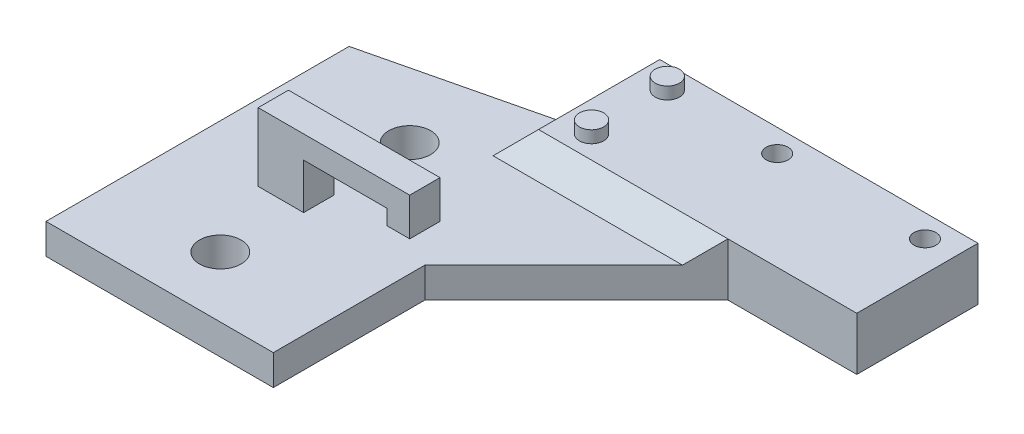
ISO-10303-21;
HEADER;
FILE_DESCRIPTION(('STEP AP214'),'2;1');
FILE_NAME('part.step','',(''),(''),'','','');
FILE_SCHEMA(('AUTOMOTIVE_DESIGN { 1 0 10303 214 1 1 1 1 }'));
ENDSEC;
DATA;
#1=APPLICATION_CONTEXT('core data for automotive mechanical design processes');
#2=APPLICATION_PROTOCOL_DEFINITION('international standard','automotive_design',2000,#1);
#3=PRODUCT_CONTEXT('',#1,'mechanical');
#4=PRODUCT('Part','Part','',(#3));
#5=PRODUCT_RELATED_PRODUCT_CATEGORY('part','',(#4));
#6=PRODUCT_DEFINITION_FORMATION('','',#4);
#7=PRODUCT_DEFINITION_CONTEXT('part definition',#1,'design');
#8=PRODUCT_DEFINITION('design','',#6,#7);
#9=PRODUCT_DEFINITION_SHAPE('','',#8);
#10=(LENGTH_UNIT() NAMED_UNIT(*) SI_UNIT(.MILLI.,.METRE.));
#11=(NAMED_UNIT(*) PLANE_ANGLE_UNIT() SI_UNIT($,.RADIAN.));
#12=(NAMED_UNIT(*) SI_UNIT($,.STERADIAN.) SOLID_ANGLE_UNIT());
#13=UNCERTAINTY_MEASURE_WITH_UNIT(LENGTH_MEASURE(1.E-05),#10,'distance_accuracy_value','');
#14=(GEOMETRIC_REPRESENTATION_CONTEXT(3) GLOBAL_UNCERTAINTY_ASSIGNED_CONTEXT((#13)) GLOBAL_UNIT_ASSIGNED_CONTEXT((#10,
#11,#12)) REPRESENTATION_CONTEXT('',''));
#15=CARTESIAN_POINT('',(0.,0.,0.));
#16=DIRECTION('',(0.,0.,1.));
#17=DIRECTION('',(1.,0.,0.));
#18=AXIS2_PLACEMENT_3D('',#15,#16,#17);
#19=CARTESIAN_POINT('',(0.,4.,0.));
#20=DIRECTION('',(0.,-1.,0.));
#21=DIRECTION('',(0.,0.,-1.));
#22=AXIS2_PLACEMENT_3D('',#19,#20,#21);
#23=PLANE('',#22);
#24=DIRECTION('',(-1.,0.,0.));
#25=VECTOR('',#24,1.);
#26=CARTESIAN_POINT('',(-21.,4.,11.));
#27=LINE('',#26,#25);
#28=CARTESIAN_POINT('',(0.999999999999994,4.,11.));
#29=VERTEX_POINT('',#28);
#30=CARTESIAN_POINT('',(-24.,4.,11.));
#31=VERTEX_POINT('',#30);
#32=EDGE_CURVE('E297',#29,#31,#27,.T.);
#33=ORIENTED_EDGE('',*,*,#32,.T.);
#34=DIRECTION('',(0.,0.,-1.));
#35=VECTOR('',#34,1.);
#36=CARTESIAN_POINT('',(-24.,4.,2.));
#37=LINE('',#36,#35);
#38=CARTESIAN_POINT('',(-24.,4.,2.72));
#39=VERTEX_POINT('',#38);
#40=EDGE_CURVE('E299',#31,#39,#37,.T.);
#41=ORIENTED_EDGE('',*,*,#40,.T.);
#42=DIRECTION('',(-0.972387301980518,0.,0.233372952475324));
#43=VECTOR('',#42,1.);
#44=CARTESIAN_POINT('',(-21.,4.,2.));
#45=LINE('',#44,#43);
#46=CARTESIAN_POINT('',(-46.,4.,8.));
#47=VERTEX_POINT('',#46);
#48=EDGE_CURVE('E208',#39,#47,#45,.T.);
#49=ORIENTED_EDGE('',*,*,#48,.T.);
#50=DIRECTION('',(0.,0.,1.));
#51=VECTOR('',#50,1.);
#52=CARTESIAN_POINT('',(-46.,4.,8.));
#53=LINE('',#52,#51);
#54=CARTESIAN_POINT('',(-46.,4.,48.));
#55=VERTEX_POINT('',#54);
#56=EDGE_CURVE('E210',#47,#55,#53,.T.);
#57=ORIENTED_EDGE('',*,*,#56,.T.);
#58=DIRECTION('',(1.,0.,0.));
#59=VECTOR('',#58,1.);
#60=CARTESIAN_POINT('',(-46.,4.,48.));
#61=LINE('',#60,#59);
#62=CARTESIAN_POINT('',(-16.,4.,48.));
#63=VERTEX_POINT('',#62);
#64=EDGE_CURVE('E213',#55,#63,#61,.T.);
#65=ORIENTED_EDGE('',*,*,#64,.T.);
#66=DIRECTION('',(0.,0.,-1.));
#67=VECTOR('',#66,1.);
#68=CARTESIAN_POINT('',(-16.,4.,48.));
#69=LINE('',#68,#67);
#70=CARTESIAN_POINT('',(-16.,4.,28.));
#71=VERTEX_POINT('',#70);
#72=EDGE_CURVE('E215',#63,#71,#69,.T.);
#73=ORIENTED_EDGE('',*,*,#72,.T.);
#74=DIRECTION('',(0.707106781186548,0.,-0.707106781186548));
#75=VECTOR('',#74,1.);
#76=CARTESIAN_POINT('',(-16.,4.,28.));
#77=LINE('',#76,#75);
#78=EDGE_CURVE('E217',#71,#29,#77,.T.);
#79=ORIENTED_EDGE('',*,*,#78,.T.);
#80=EDGE_LOOP('',(#33,#41,#49,#57,#65,#73,#79));
#81=FACE_BOUND('',#80,.T.);
#82=CARTESIAN_POINT('',(-31.,4.,40.));
#83=DIRECTION('',(0.,-1.,0.));
#84=DIRECTION('',(0.,0.,-1.));
#85=AXIS2_PLACEMENT_3D('',#82,#83,#84);
#86=CIRCLE('',#85,2.75);
#87=CARTESIAN_POINT('',(-31.,4.,37.25));
#88=VERTEX_POINT('',#87);
#89=EDGE_CURVE('E200',#88,#88,#86,.T.);
#90=ORIENTED_EDGE('',*,*,#89,.T.);
#91=EDGE_LOOP('',(#90));
#92=FACE_BOUND('',#91,.T.);
#93=CARTESIAN_POINT('',(-31.,4.,15.));
#94=DIRECTION('',(0.,-1.,0.));
#95=DIRECTION('',(0.,0.,-1.));
#96=AXIS2_PLACEMENT_3D('',#93,#94,#95);
#97=CIRCLE('',#96,2.74999999999999);
#98=CARTESIAN_POINT('',(-31.,4.,12.25));
#99=VERTEX_POINT('',#98);
#100=EDGE_CURVE('E190',#99,#99,#97,.T.);
#101=ORIENTED_EDGE('',*,*,#100,.T.);
#102=EDGE_LOOP('',(#101));
#103=FACE_BOUND('',#102,.T.);
#104=DIRECTION('',(1.,0.,0.));
#105=VECTOR('',#104,1.);
#106=CARTESIAN_POINT('',(-30.,4.,30.));
#107=LINE('',#106,#105);
#108=CARTESIAN_POINT('',(-36.,4.,30.));
#109=VERTEX_POINT('',#108);
#110=CARTESIAN_POINT('',(-30.,4.,30.));
#111=VERTEX_POINT('',#110);
#112=EDGE_CURVE('E176',#109,#111,#107,.T.);
#113=ORIENTED_EDGE('',*,*,#112,.F.);
#114=DIRECTION('',(0.,0.,-1.));
#115=VECTOR('',#114,1.);
#116=CARTESIAN_POINT('',(-36.,4.,30.));
#117=LINE('',#116,#115);
#118=CARTESIAN_POINT('',(-36.,4.,26.));
#119=VERTEX_POINT('',#118);
#120=EDGE_CURVE('E335',#109,#119,#117,.T.);
#121=ORIENTED_EDGE('',*,*,#120,.T.);
#122=DIRECTION('',(1.,0.,0.));
#123=VECTOR('',#122,1.);
#124=CARTESIAN_POINT('',(-30.,4.,26.));
#125=LINE('',#124,#123);
#126=CARTESIAN_POINT('',(-30.,4.,26.));
#127=VERTEX_POINT('',#126);
#128=EDGE_CURVE('E189',#119,#127,#125,.T.);
#129=ORIENTED_EDGE('',*,*,#128,.T.);
#130=DIRECTION('',(0.,0.,-1.));
#131=VECTOR('',#130,1.);
#132=CARTESIAN_POINT('',(-30.,4.,30.));
#133=LINE('',#132,#131);
#134=EDGE_CURVE('E169',#111,#127,#133,.T.);
#135=ORIENTED_EDGE('',*,*,#134,.F.);
#136=EDGE_LOOP('',(#113,#121,#129,#135));
#137=FACE_BOUND('',#136,.T.);
#138=ADVANCED_FACE('F33',(#81,#92,#103,#137),#23,.F.);
#139=CARTESIAN_POINT('',(-21.,7.,-8.));
#140=DIRECTION('',(1.,0.,0.));
#141=DIRECTION('',(0.,0.,-1.));
#142=AXIS2_PLACEMENT_3D('',#139,#140,#141);
#143=PLANE('',#142);
#144=DIRECTION('',(0.,-1.,0.));
#145=VECTOR('',#144,1.);
#146=CARTESIAN_POINT('',(-21.,4.,2.));
#147=LINE('',#146,#145);
#148=CARTESIAN_POINT('',(-21.,7.,2.));
#149=VERTEX_POINT('',#148);
#150=CARTESIAN_POINT('',(-21.,0.,2.));
#151=VERTEX_POINT('',#150);
#152=EDGE_CURVE('E56',#149,#151,#147,.T.);
#153=ORIENTED_EDGE('',*,*,#152,.F.);
#154=DIRECTION('',(0.,0.,1.));
#155=VECTOR('',#154,1.);
#156=CARTESIAN_POINT('',(-21.,7.,-8.));
#157=LINE('',#156,#155);
#158=CARTESIAN_POINT('',(-21.,7.,-8.));
#159=VERTEX_POINT('',#158);
#160=EDGE_CURVE('E274',#159,#149,#157,.T.);
#161=ORIENTED_EDGE('',*,*,#160,.F.);
#162=DIRECTION('',(0.,-1.,0.));
#163=VECTOR('',#162,1.);
#164=CARTESIAN_POINT('',(-21.,7.,-8.));
#165=LINE('',#164,#163);
#166=CARTESIAN_POINT('',(-21.,0.,-8.));
#167=VERTEX_POINT('',#166);
#168=EDGE_CURVE('E291',#159,#167,#165,.T.);
#169=ORIENTED_EDGE('',*,*,#168,.T.);
#170=DIRECTION('',(0.,0.,1.));
#171=VECTOR('',#170,1.);
#172=CARTESIAN_POINT('',(-21.,0.,-8.));
#173=LINE('',#172,#171);
#174=EDGE_CURVE('E286',#167,#151,#173,.T.);
#175=ORIENTED_EDGE('',*,*,#174,.T.);
#176=EDGE_LOOP('',(#153,#161,#169,#175));
#177=FACE_BOUND('',#176,.T.);
#178=ADVANCED_FACE('F390',(#177),#143,.F.);
#179=CARTESIAN_POINT('',(-21.,7.,8.));
#180=DIRECTION('',(0.,0.,-1.));
#181=DIRECTION('',(-1.,0.,0.));
#182=AXIS2_PLACEMENT_3D('',#179,#180,#181);
#183=PLANE('',#182);
#184=DIRECTION('',(1.,0.,0.));
#185=VECTOR('',#184,1.);
#186=CARTESIAN_POINT('',(-21.,7.,8.));
#187=LINE('',#186,#185);
#188=CARTESIAN_POINT('',(4.,7.,8.));
#189=VERTEX_POINT('',#188);
#190=CARTESIAN_POINT('',(21.,7.,8.));
#191=VERTEX_POINT('',#190);
#192=EDGE_CURVE('E277',#189,#191,#187,.T.);
#193=ORIENTED_EDGE('',*,*,#192,.F.);
#194=DIRECTION('',(0.,-1.,0.));
#195=VECTOR('',#194,1.);
#196=CARTESIAN_POINT('',(4.00000000000001,4.,8.));
#197=LINE('',#196,#195);
#198=CARTESIAN_POINT('',(4.00000000000001,0.,8.));
#199=VERTEX_POINT('',#198);
#200=EDGE_CURVE('E48',#189,#199,#197,.T.);
#201=ORIENTED_EDGE('',*,*,#200,.T.);
#202=DIRECTION('',(1.,0.,0.));
#203=VECTOR('',#202,1.);
#204=CARTESIAN_POINT('',(-21.,0.,8.));
#205=LINE('',#204,#203);
#206=CARTESIAN_POINT('',(21.,0.,8.));
#207=VERTEX_POINT('',#206);
#208=EDGE_CURVE('E271',#199,#207,#205,.T.);
#209=ORIENTED_EDGE('',*,*,#208,.T.);
#210=DIRECTION('',(0.,-1.,0.));
#211=VECTOR('',#210,1.);
#212=CARTESIAN_POINT('',(21.,7.,8.));
#213=LINE('',#212,#211);
#214=EDGE_CURVE('E281',#191,#207,#213,.T.);
#215=ORIENTED_EDGE('',*,*,#214,.F.);
#216=EDGE_LOOP('',(#193,#201,#209,#215));
#217=FACE_BOUND('',#216,.T.);
#218=ADVANCED_FACE('F396',(#217),#183,.F.);
#219=CARTESIAN_POINT('',(21.,7.,-8.));
#220=DIRECTION('',(-1.,0.,0.));
#221=DIRECTION('',(0.,0.,1.));
#222=AXIS2_PLACEMENT_3D('',#219,#220,#221);
#223=PLANE('',#222);
#224=DIRECTION('',(0.,0.,-1.));
#225=VECTOR('',#224,1.);
#226=CARTESIAN_POINT('',(21.,0.,-8.));
#227=LINE('',#226,#225);
#228=CARTESIAN_POINT('',(21.,0.,-8.));
#229=VERTEX_POINT('',#228);
#230=EDGE_CURVE('E264',#207,#229,#227,.T.);
#231=ORIENTED_EDGE('',*,*,#230,.T.);
#232=DIRECTION('',(0.,-1.,0.));
#233=VECTOR('',#232,1.);
#234=CARTESIAN_POINT('',(21.,7.,-8.));
#235=LINE('',#234,#233);
#236=CARTESIAN_POINT('',(21.,7.,-8.));
#237=VERTEX_POINT('',#236);
#238=EDGE_CURVE('E294',#237,#229,#235,.T.);
#239=ORIENTED_EDGE('',*,*,#238,.F.);
#240=DIRECTION('',(0.,0.,-1.));
#241=VECTOR('',#240,1.);
#242=CARTESIAN_POINT('',(21.,7.,-8.));
#243=LINE('',#242,#241);
#244=EDGE_CURVE('E267',#191,#237,#243,.T.);
#245=ORIENTED_EDGE('',*,*,#244,.F.);
#246=ORIENTED_EDGE('',*,*,#214,.T.);
#247=EDGE_LOOP('',(#231,#239,#245,#246));
#248=FACE_BOUND('',#247,.T.);
#249=ADVANCED_FACE('F453',(#248),#223,.F.);
#250=CARTESIAN_POINT('',(-21.,7.,-8.));
#251=DIRECTION('',(0.,0.,1.));
#252=DIRECTION('',(1.,0.,0.));
#253=AXIS2_PLACEMENT_3D('',#250,#251,#252);
#254=PLANE('',#253);
#255=DIRECTION('',(-1.,0.,0.));
#256=VECTOR('',#255,1.);
#257=CARTESIAN_POINT('',(-21.,0.,-8.));
#258=LINE('',#257,#256);
#259=EDGE_CURVE('E284',#229,#167,#258,.T.);
#260=ORIENTED_EDGE('',*,*,#259,.T.);
#261=ORIENTED_EDGE('',*,*,#168,.F.);
#262=DIRECTION('',(-1.,0.,0.));
#263=VECTOR('',#262,1.);
#264=CARTESIAN_POINT('',(-21.,7.,-8.));
#265=LINE('',#264,#263);
#266=EDGE_CURVE('E270',#237,#159,#265,.T.);
#267=ORIENTED_EDGE('',*,*,#266,.F.);
#268=ORIENTED_EDGE('',*,*,#238,.T.);
#269=EDGE_LOOP('',(#260,#261,#267,#268));
#270=FACE_BOUND('',#269,.T.);
#271=ADVANCED_FACE('F447',(#270),#254,.F.);
#272=CARTESIAN_POINT('',(0.,7.,0.));
#273=DIRECTION('',(0.,1.,0.));
#274=DIRECTION('',(0.,0.,1.));
#275=AXIS2_PLACEMENT_3D('',#272,#273,#274);
#276=PLANE('',#275);
#277=CARTESIAN_POINT('',(17.,7.,-5.));
#278=DIRECTION('',(0.,1.,0.));
#279=DIRECTION('',(0.,0.,1.));
#280=AXIS2_PLACEMENT_3D('',#277,#278,#279);
#281=CIRCLE('',#280,1.45);
#282=CARTESIAN_POINT('',(17.,7.,-3.55));
#283=VERTEX_POINT('',#282);
#284=EDGE_CURVE('E245',#283,#283,#281,.T.);
#285=ORIENTED_EDGE('',*,*,#284,.F.);
#286=EDGE_LOOP('',(#285));
#287=FACE_BOUND('',#286,.T.);
#288=CARTESIAN_POINT('',(-2.5,7.,-5.));
#289=DIRECTION('',(0.,1.,0.));
#290=DIRECTION('',(0.,0.,1.));
#291=AXIS2_PLACEMENT_3D('',#288,#289,#290);
#292=CIRCLE('',#291,1.45);
#293=CARTESIAN_POINT('',(-2.5,7.,-3.55));
#294=VERTEX_POINT('',#293);
#295=EDGE_CURVE('E251',#294,#294,#292,.T.);
#296=ORIENTED_EDGE('',*,*,#295,.F.);
#297=EDGE_LOOP('',(#296));
#298=FACE_BOUND('',#297,.T.);
#299=CARTESIAN_POINT('',(-17.,7.,5.));
#300=DIRECTION('',(0.,1.,0.));
#301=DIRECTION('',(0.,0.,1.));
#302=AXIS2_PLACEMENT_3D('',#299,#300,#301);
#303=CIRCLE('',#302,1.6);
#304=CARTESIAN_POINT('',(-17.,7.,6.6));
#305=VERTEX_POINT('',#304);
#306=EDGE_CURVE('E254',#305,#305,#303,.T.);
#307=ORIENTED_EDGE('',*,*,#306,.F.);
#308=EDGE_LOOP('',(#307));
#309=FACE_BOUND('',#308,.T.);
#310=CARTESIAN_POINT('',(-17.,7.,-5.));
#311=DIRECTION('',(0.,1.,0.));
#312=DIRECTION('',(0.,0.,1.));
#313=AXIS2_PLACEMENT_3D('',#310,#311,#312);
#314=CIRCLE('',#313,1.6);
#315=CARTESIAN_POINT('',(-17.,7.,-3.4));
#316=VERTEX_POINT('',#315);
#317=EDGE_CURVE('E258',#316,#316,#314,.T.);
#318=ORIENTED_EDGE('',*,*,#317,.F.);
#319=EDGE_LOOP('',(#318));
#320=FACE_BOUND('',#319,.T.);
#321=ORIENTED_EDGE('',*,*,#244,.T.);
#322=ORIENTED_EDGE('',*,*,#266,.T.);
#323=ORIENTED_EDGE('',*,*,#160,.T.);
#324=CARTESIAN_POINT('',(-21.,7.,8.));
#325=VERTEX_POINT('',#324);
#326=EDGE_CURVE('E273',#149,#325,#157,.T.);
#327=ORIENTED_EDGE('',*,*,#326,.T.);
#328=EDGE_CURVE('E278',#325,#189,#187,.T.);
#329=ORIENTED_EDGE('',*,*,#328,.T.);
#330=ORIENTED_EDGE('',*,*,#192,.T.);
#331=EDGE_LOOP('',(#321,#322,#323,#327,#329,#330));
#332=FACE_BOUND('',#331,.T.);
#333=ADVANCED_FACE('F310',(#287,#298,#309,#320,#332),#276,.T.);
#334=CARTESIAN_POINT('',(0.,0.,0.));
#335=DIRECTION('',(0.,1.,0.));
#336=DIRECTION('',(0.,0.,1.));
#337=AXIS2_PLACEMENT_3D('',#334,#335,#336);
#338=PLANE('',#337);
#339=CARTESIAN_POINT('',(-31.,0.,15.));
#340=DIRECTION('',(0.,1.,0.));
#341=DIRECTION('',(0.,0.,1.));
#342=AXIS2_PLACEMENT_3D('',#339,#340,#341);
#343=CIRCLE('',#342,2.74999999999999);
#344=CARTESIAN_POINT('',(-31.,0.,17.75));
#345=VERTEX_POINT('',#344);
#346=EDGE_CURVE('E193',#345,#345,#343,.T.);
#347=ORIENTED_EDGE('',*,*,#346,.T.);
#348=EDGE_LOOP('',(#347));
#349=FACE_BOUND('',#348,.T.);
#350=CARTESIAN_POINT('',(-31.,0.,40.));
#351=DIRECTION('',(0.,1.,0.));
#352=DIRECTION('',(0.,0.,1.));
#353=AXIS2_PLACEMENT_3D('',#350,#351,#352);
#354=CIRCLE('',#353,2.75);
#355=CARTESIAN_POINT('',(-31.,0.,42.75));
#356=VERTEX_POINT('',#355);
#357=EDGE_CURVE('E202',#356,#356,#354,.T.);
#358=ORIENTED_EDGE('',*,*,#357,.T.);
#359=EDGE_LOOP('',(#358));
#360=FACE_BOUND('',#359,.T.);
#361=DIRECTION('',(-0.972387301980518,0.,0.233372952475324));
#362=VECTOR('',#361,1.);
#363=CARTESIAN_POINT('',(-21.,0.,2.));
#364=LINE('',#363,#362);
#365=CARTESIAN_POINT('',(-46.,0.,8.));
#366=VERTEX_POINT('',#365);
#367=EDGE_CURVE('E205',#151,#366,#364,.T.);
#368=ORIENTED_EDGE('',*,*,#367,.F.);
#369=ORIENTED_EDGE('',*,*,#174,.F.);
#370=ORIENTED_EDGE('',*,*,#259,.F.);
#371=ORIENTED_EDGE('',*,*,#230,.F.);
#372=ORIENTED_EDGE('',*,*,#208,.F.);
#373=DIRECTION('',(0.707106781186548,0.,-0.707106781186548));
#374=VECTOR('',#373,1.);
#375=CARTESIAN_POINT('',(-16.,0.,28.));
#376=LINE('',#375,#374);
#377=CARTESIAN_POINT('',(-16.,0.,28.));
#378=VERTEX_POINT('',#377);
#379=EDGE_CURVE('E211',#378,#199,#376,.T.);
#380=ORIENTED_EDGE('',*,*,#379,.F.);
#381=DIRECTION('',(0.,0.,-1.));
#382=VECTOR('',#381,1.);
#383=CARTESIAN_POINT('',(-16.,0.,48.));
#384=LINE('',#383,#382);
#385=CARTESIAN_POINT('',(-16.,0.,48.));
#386=VERTEX_POINT('',#385);
#387=EDGE_CURVE('E225',#386,#378,#384,.T.);
#388=ORIENTED_EDGE('',*,*,#387,.F.);
#389=DIRECTION('',(1.,0.,0.));
#390=VECTOR('',#389,1.);
#391=CARTESIAN_POINT('',(-46.,0.,48.));
#392=LINE('',#391,#390);
#393=CARTESIAN_POINT('',(-46.,0.,48.));
#394=VERTEX_POINT('',#393);
#395=EDGE_CURVE('E223',#394,#386,#392,.T.);
#396=ORIENTED_EDGE('',*,*,#395,.F.);
#397=DIRECTION('',(0.,0.,1.));
#398=VECTOR('',#397,1.);
#399=CARTESIAN_POINT('',(-46.,0.,8.));
#400=LINE('',#399,#398);
#401=EDGE_CURVE('E221',#366,#394,#400,.T.);
#402=ORIENTED_EDGE('',*,*,#401,.F.);
#403=EDGE_LOOP('',(#368,#369,#370,#371,#372,#380,#388,#396,#402));
#404=FACE_BOUND('',#403,.T.);
#405=CARTESIAN_POINT('',(17.,0.,-5.));
#406=DIRECTION('',(0.,1.,0.));
#407=DIRECTION('',(0.,0.,1.));
#408=AXIS2_PLACEMENT_3D('',#405,#406,#407);
#409=CIRCLE('',#408,1.45);
#410=CARTESIAN_POINT('',(17.,0.,-3.55));
#411=VERTEX_POINT('',#410);
#412=EDGE_CURVE('E242',#411,#411,#409,.T.);
#413=ORIENTED_EDGE('',*,*,#412,.T.);
#414=EDGE_LOOP('',(#413));
#415=FACE_BOUND('',#414,.T.);
#416=CARTESIAN_POINT('',(-2.5,0.,-5.));
#417=DIRECTION('',(0.,1.,0.));
#418=DIRECTION('',(0.,0.,1.));
#419=AXIS2_PLACEMENT_3D('',#416,#417,#418);
#420=CIRCLE('',#419,1.45);
#421=CARTESIAN_POINT('',(-2.5,0.,-3.55));
#422=VERTEX_POINT('',#421);
#423=EDGE_CURVE('E248',#422,#422,#420,.T.);
#424=ORIENTED_EDGE('',*,*,#423,.T.);
#425=EDGE_LOOP('',(#424));
#426=FACE_BOUND('',#425,.T.);
#427=ADVANCED_FACE('F443',(#349,#360,#404,#415,#426),#338,.F.);
#428=CARTESIAN_POINT('',(-17.,8.6,-5.));
#429=DIRECTION('',(0.,-1.,0.));
#430=DIRECTION('',(0.,0.,-1.));
#431=AXIS2_PLACEMENT_3D('',#428,#429,#430);
#432=CYLINDRICAL_SURFACE('',#431,1.6);
#433=CARTESIAN_POINT('',(-17.,8.6,-5.));
#434=DIRECTION('',(0.,1.,0.));
#435=DIRECTION('',(0.,0.,1.));
#436=AXIS2_PLACEMENT_3D('',#433,#434,#435);
#437=CIRCLE('',#436,1.6);
#438=CARTESIAN_POINT('',(-17.,8.6,-3.4));
#439=VERTEX_POINT('',#438);
#440=EDGE_CURVE('E261',#439,#439,#437,.T.);
#441=ORIENTED_EDGE('',*,*,#440,.F.);
#442=EDGE_LOOP('',(#441));
#443=FACE_BOUND('',#442,.T.);
#444=ORIENTED_EDGE('',*,*,#317,.T.);
#445=EDGE_LOOP('',(#444));
#446=FACE_BOUND('',#445,.T.);
#447=ADVANCED_FACE('F439',(#443,#446),#432,.T.);
#448=CARTESIAN_POINT('',(-17.,8.6,-5.));
#449=DIRECTION('',(0.,1.,0.));
#450=DIRECTION('',(0.,0.,1.));
#451=AXIS2_PLACEMENT_3D('',#448,#449,#450);
#452=PLANE('',#451);
#453=ORIENTED_EDGE('',*,*,#440,.T.);
#454=EDGE_LOOP('',(#453));
#455=FACE_BOUND('',#454,.T.);
#456=ADVANCED_FACE('F435',(#455),#452,.T.);
#457=CARTESIAN_POINT('',(-17.,8.6,5.));
#458=DIRECTION('',(0.,-1.,0.));
#459=DIRECTION('',(0.,0.,-1.));
#460=AXIS2_PLACEMENT_3D('',#457,#458,#459);
#461=CYLINDRICAL_SURFACE('',#460,1.6);
#462=CARTESIAN_POINT('',(-17.,8.6,5.));
#463=DIRECTION('',(0.,1.,0.));
#464=DIRECTION('',(0.,0.,1.));
#465=AXIS2_PLACEMENT_3D('',#462,#463,#464);
#466=CIRCLE('',#465,1.6);
#467=CARTESIAN_POINT('',(-17.,8.6,6.6));
#468=VERTEX_POINT('',#467);
#469=EDGE_CURVE('E255',#468,#468,#466,.T.);
#470=ORIENTED_EDGE('',*,*,#469,.F.);
#471=EDGE_LOOP('',(#470));
#472=FACE_BOUND('',#471,.T.);
#473=ORIENTED_EDGE('',*,*,#306,.T.);
#474=EDGE_LOOP('',(#473));
#475=FACE_BOUND('',#474,.T.);
#476=ADVANCED_FACE('F431',(#472,#475),#461,.T.);
#477=CARTESIAN_POINT('',(-17.,8.6,5.));
#478=DIRECTION('',(0.,1.,0.));
#479=DIRECTION('',(0.,0.,1.));
#480=AXIS2_PLACEMENT_3D('',#477,#478,#479);
#481=PLANE('',#480);
#482=ORIENTED_EDGE('',*,*,#469,.T.);
#483=EDGE_LOOP('',(#482));
#484=FACE_BOUND('',#483,.T.);
#485=ADVANCED_FACE('F427',(#484),#481,.T.);
#486=CARTESIAN_POINT('',(-2.5,8.601,-5.));
#487=DIRECTION('',(0.,-1.,0.));
#488=DIRECTION('',(0.,0.,-1.));
#489=AXIS2_PLACEMENT_3D('',#486,#487,#488);
#490=CYLINDRICAL_SURFACE('',#489,1.45);
#491=ORIENTED_EDGE('',*,*,#295,.T.);
#492=EDGE_LOOP('',(#491));
#493=FACE_BOUND('',#492,.T.);
#494=ORIENTED_EDGE('',*,*,#423,.F.);
#495=EDGE_LOOP('',(#494));
#496=FACE_BOUND('',#495,.T.);
#497=ADVANCED_FACE('F423',(#493,#496),#490,.F.);
#498=CARTESIAN_POINT('',(17.,8.601,-5.));
#499=DIRECTION('',(0.,-1.,0.));
#500=DIRECTION('',(0.,0.,-1.));
#501=AXIS2_PLACEMENT_3D('',#498,#499,#500);
#502=CYLINDRICAL_SURFACE('',#501,1.45);
#503=ORIENTED_EDGE('',*,*,#284,.T.);
#504=EDGE_LOOP('',(#503));
#505=FACE_BOUND('',#504,.T.);
#506=ORIENTED_EDGE('',*,*,#412,.F.);
#507=EDGE_LOOP('',(#506));
#508=FACE_BOUND('',#507,.T.);
#509=ADVANCED_FACE('F420',(#505,#508),#502,.F.);
#510=CARTESIAN_POINT('',(-21.,4.,2.));
#511=DIRECTION('',(0.233372952475324,0.,0.972387301980517));
#512=DIRECTION('',(0.972387301980518,0.,-0.233372952475324));
#513=AXIS2_PLACEMENT_3D('',#510,#511,#512);
#514=PLANE('',#513);
#515=ORIENTED_EDGE('',*,*,#367,.T.);
#516=DIRECTION('',(0.,-1.,0.));
#517=VECTOR('',#516,1.);
#518=CARTESIAN_POINT('',(-46.,4.,8.));
#519=LINE('',#518,#517);
#520=EDGE_CURVE('E238',#47,#366,#519,.T.);
#521=ORIENTED_EDGE('',*,*,#520,.F.);
#522=ORIENTED_EDGE('',*,*,#48,.F.);
#523=DIRECTION('',(-0.697139233166454,-0.697139233166447,0.167313415959949));
#524=VECTOR('',#523,1.);
#525=CARTESIAN_POINT('',(-22.4580093312597,5.54199066874029,2.34992223950233));
#526=LINE('',#525,#524);
#527=EDGE_CURVE('E42',#39,#149,#526,.F.);
#528=ORIENTED_EDGE('',*,*,#527,.T.);
#529=ORIENTED_EDGE('',*,*,#152,.T.);
#530=EDGE_LOOP('',(#515,#521,#522,#528,#529));
#531=FACE_BOUND('',#530,.T.);
#532=ADVANCED_FACE('F304',(#531),#514,.F.);
#533=CARTESIAN_POINT('',(-46.,4.,8.));
#534=DIRECTION('',(1.,0.,0.));
#535=DIRECTION('',(0.,0.,-1.));
#536=AXIS2_PLACEMENT_3D('',#533,#534,#535);
#537=PLANE('',#536);
#538=ORIENTED_EDGE('',*,*,#401,.T.);
#539=DIRECTION('',(0.,-1.,0.));
#540=VECTOR('',#539,1.);
#541=CARTESIAN_POINT('',(-46.,4.,48.));
#542=LINE('',#541,#540);
#543=EDGE_CURVE('E235',#55,#394,#542,.T.);
#544=ORIENTED_EDGE('',*,*,#543,.F.);
#545=ORIENTED_EDGE('',*,*,#56,.F.);
#546=ORIENTED_EDGE('',*,*,#520,.T.);
#547=EDGE_LOOP('',(#538,#544,#545,#546));
#548=FACE_BOUND('',#547,.T.);
#549=ADVANCED_FACE('F413',(#548),#537,.F.);
#550=CARTESIAN_POINT('',(-46.,4.,48.));
#551=DIRECTION('',(0.,0.,-1.));
#552=DIRECTION('',(-1.,0.,0.));
#553=AXIS2_PLACEMENT_3D('',#550,#551,#552);
#554=PLANE('',#553);
#555=ORIENTED_EDGE('',*,*,#395,.T.);
#556=DIRECTION('',(0.,-1.,0.));
#557=VECTOR('',#556,1.);
#558=CARTESIAN_POINT('',(-16.,4.,48.));
#559=LINE('',#558,#557);
#560=EDGE_CURVE('E232',#63,#386,#559,.T.);
#561=ORIENTED_EDGE('',*,*,#560,.F.);
#562=ORIENTED_EDGE('',*,*,#64,.F.);
#563=ORIENTED_EDGE('',*,*,#543,.T.);
#564=EDGE_LOOP('',(#555,#561,#562,#563));
#565=FACE_BOUND('',#564,.T.);
#566=ADVANCED_FACE('F409',(#565),#554,.F.);
#567=CARTESIAN_POINT('',(-16.,4.,48.));
#568=DIRECTION('',(-1.,0.,0.));
#569=DIRECTION('',(0.,0.,1.));
#570=AXIS2_PLACEMENT_3D('',#567,#568,#569);
#571=PLANE('',#570);
#572=ORIENTED_EDGE('',*,*,#387,.T.);
#573=DIRECTION('',(0.,-1.,0.));
#574=VECTOR('',#573,1.);
#575=CARTESIAN_POINT('',(-16.,4.,28.));
#576=LINE('',#575,#574);
#577=EDGE_CURVE('E229',#71,#378,#576,.T.);
#578=ORIENTED_EDGE('',*,*,#577,.F.);
#579=ORIENTED_EDGE('',*,*,#72,.F.);
#580=ORIENTED_EDGE('',*,*,#560,.T.);
#581=EDGE_LOOP('',(#572,#578,#579,#580));
#582=FACE_BOUND('',#581,.T.);
#583=ADVANCED_FACE('F406',(#582),#571,.F.);
#584=CARTESIAN_POINT('',(-16.,4.,28.));
#585=DIRECTION('',(-0.707106781186547,0.,-0.707106781186547));
#586=DIRECTION('',(-0.707106781186548,0.,0.707106781186548));
#587=AXIS2_PLACEMENT_3D('',#584,#585,#586);
#588=PLANE('',#587);
#589=ORIENTED_EDGE('',*,*,#379,.T.);
#590=ORIENTED_EDGE('',*,*,#200,.F.);
#591=DIRECTION('',(0.577350269189628,0.577350269189621,-0.577350269189628));
#592=VECTOR('',#591,1.);
#593=CARTESIAN_POINT('',(-10.3333333333334,-7.33333333333328,22.3333333333334));
#594=LINE('',#593,#592);
#595=EDGE_CURVE('E11',#189,#29,#594,.F.);
#596=ORIENTED_EDGE('',*,*,#595,.T.);
#597=ORIENTED_EDGE('',*,*,#78,.F.);
#598=ORIENTED_EDGE('',*,*,#577,.T.);
#599=EDGE_LOOP('',(#589,#590,#596,#597,#598));
#600=FACE_BOUND('',#599,.T.);
#601=ADVANCED_FACE('F403',(#600),#588,.F.);
#602=CARTESIAN_POINT('',(-31.,8.601,40.));
#603=DIRECTION('',(0.,-1.,0.));
#604=DIRECTION('',(0.,0.,-1.));
#605=AXIS2_PLACEMENT_3D('',#602,#603,#604);
#606=CYLINDRICAL_SURFACE('',#605,2.75);
#607=ORIENTED_EDGE('',*,*,#357,.F.);
#608=EDGE_LOOP('',(#607));
#609=FACE_BOUND('',#608,.T.);
#610=ORIENTED_EDGE('',*,*,#89,.F.);
#611=EDGE_LOOP('',(#610));
#612=FACE_BOUND('',#611,.T.);
#613=ADVANCED_FACE('F401',(#609,#612),#606,.F.);
#614=CARTESIAN_POINT('',(-31.,8.601,15.));
#615=DIRECTION('',(0.,-1.,0.));
#616=DIRECTION('',(0.,0.,-1.));
#617=AXIS2_PLACEMENT_3D('',#614,#615,#616);
#618=CYLINDRICAL_SURFACE('',#617,2.74999999999999);
#619=ORIENTED_EDGE('',*,*,#346,.F.);
#620=EDGE_LOOP('',(#619));
#621=FACE_BOUND('',#620,.T.);
#622=ORIENTED_EDGE('',*,*,#100,.F.);
#623=EDGE_LOOP('',(#622));
#624=FACE_BOUND('',#623,.T.);
#625=ADVANCED_FACE('F387',(#621,#624),#618,.F.);
#626=CARTESIAN_POINT('',(-30.,10.,30.));
#627=DIRECTION('',(-1.,0.,0.));
#628=DIRECTION('',(0.,0.,1.));
#629=AXIS2_PLACEMENT_3D('',#626,#627,#628);
#630=PLANE('',#629);
#631=DIRECTION('',(0.,1.,0.));
#632=VECTOR('',#631,1.);
#633=CARTESIAN_POINT('',(-30.,10.,26.));
#634=LINE('',#633,#632);
#635=CARTESIAN_POINT('',(-30.,10.,26.));
#636=VERTEX_POINT('',#635);
#637=EDGE_CURVE('E318',#127,#636,#634,.T.);
#638=ORIENTED_EDGE('',*,*,#637,.T.);
#639=DIRECTION('',(0.,0.,-1.));
#640=VECTOR('',#639,1.);
#641=CARTESIAN_POINT('',(-30.,10.,30.));
#642=LINE('',#641,#640);
#643=CARTESIAN_POINT('',(-30.,10.,30.));
#644=VERTEX_POINT('',#643);
#645=EDGE_CURVE('E172',#644,#636,#642,.T.);
#646=ORIENTED_EDGE('',*,*,#645,.F.);
#647=DIRECTION('',(0.,1.,0.));
#648=VECTOR('',#647,1.);
#649=CARTESIAN_POINT('',(-30.,10.,30.));
#650=LINE('',#649,#648);
#651=EDGE_CURVE('E165',#111,#644,#650,.T.);
#652=ORIENTED_EDGE('',*,*,#651,.F.);
#653=ORIENTED_EDGE('',*,*,#134,.T.);
#654=EDGE_LOOP('',(#638,#646,#652,#653));
#655=FACE_BOUND('',#654,.T.);
#656=ADVANCED_FACE('F167',(#655),#630,.F.);
#657=CARTESIAN_POINT('',(-19.,10.,30.));
#658=DIRECTION('',(0.,1.,0.));
#659=DIRECTION('',(-1.,0.,0.));
#660=AXIS2_PLACEMENT_3D('',#657,#658,#659);
#661=PLANE('',#660);
#662=DIRECTION('',(1.,0.,0.));
#663=VECTOR('',#662,1.);
#664=CARTESIAN_POINT('',(-19.,10.,26.));
#665=LINE('',#664,#663);
#666=CARTESIAN_POINT('',(-19.,10.,26.));
#667=VERTEX_POINT('',#666);
#668=EDGE_CURVE('E320',#636,#667,#665,.T.);
#669=ORIENTED_EDGE('',*,*,#668,.T.);
#670=DIRECTION('',(0.,0.,-1.));
#671=VECTOR('',#670,1.);
#672=CARTESIAN_POINT('',(-19.,10.,30.));
#673=LINE('',#672,#671);
#674=CARTESIAN_POINT('',(-19.,10.,30.));
#675=VERTEX_POINT('',#674);
#676=EDGE_CURVE('E195',#675,#667,#673,.T.);
#677=ORIENTED_EDGE('',*,*,#676,.F.);
#678=DIRECTION('',(1.,0.,0.));
#679=VECTOR('',#678,1.);
#680=CARTESIAN_POINT('',(-19.,10.,30.));
#681=LINE('',#680,#679);
#682=EDGE_CURVE('E175',#644,#675,#681,.T.);
#683=ORIENTED_EDGE('',*,*,#682,.F.);
#684=ORIENTED_EDGE('',*,*,#645,.T.);
#685=EDGE_LOOP('',(#669,#677,#683,#684));
#686=FACE_BOUND('',#685,.T.);
#687=ADVANCED_FACE('F379',(#686),#661,.F.);
#688=CARTESIAN_POINT('',(-19.,8.,30.));
#689=DIRECTION('',(1.,0.,0.));
#690=DIRECTION('',(0.,0.,-1.));
#691=AXIS2_PLACEMENT_3D('',#688,#689,#690);
#692=PLANE('',#691);
#693=DIRECTION('',(0.,-1.,0.));
#694=VECTOR('',#693,1.);
#695=CARTESIAN_POINT('',(-19.,8.,26.));
#696=LINE('',#695,#694);
#697=CARTESIAN_POINT('',(-19.,8.,26.));
#698=VERTEX_POINT('',#697);
#699=EDGE_CURVE('E326',#667,#698,#696,.T.);
#700=ORIENTED_EDGE('',*,*,#699,.T.);
#701=DIRECTION('',(0.,0.,-1.));
#702=VECTOR('',#701,1.);
#703=CARTESIAN_POINT('',(-19.,8.,30.));
#704=LINE('',#703,#702);
#705=CARTESIAN_POINT('',(-19.,8.,30.));
#706=VERTEX_POINT('',#705);
#707=EDGE_CURVE('E346',#706,#698,#704,.T.);
#708=ORIENTED_EDGE('',*,*,#707,.F.);
#709=DIRECTION('',(0.,-1.,0.));
#710=VECTOR('',#709,1.);
#711=CARTESIAN_POINT('',(-19.,8.,30.));
#712=LINE('',#711,#710);
#713=EDGE_CURVE('E355',#675,#706,#712,.T.);
#714=ORIENTED_EDGE('',*,*,#713,.F.);
#715=ORIENTED_EDGE('',*,*,#676,.T.);
#716=EDGE_LOOP('',(#700,#708,#714,#715));
#717=FACE_BOUND('',#716,.T.);
#718=ADVANCED_FACE('F353',(#717),#692,.F.);
#719=CARTESIAN_POINT('',(-16.,8.,30.));
#720=DIRECTION('',(0.,1.,0.));
#721=DIRECTION('',(-1.,0.,0.));
#722=AXIS2_PLACEMENT_3D('',#719,#720,#721);
#723=PLANE('',#722);
#724=DIRECTION('',(1.,0.,0.));
#725=VECTOR('',#724,1.);
#726=CARTESIAN_POINT('',(-16.,8.,26.));
#727=LINE('',#726,#725);
#728=CARTESIAN_POINT('',(-16.,8.,26.));
#729=VERTEX_POINT('',#728);
#730=EDGE_CURVE('E328',#698,#729,#727,.T.);
#731=ORIENTED_EDGE('',*,*,#730,.T.);
#732=DIRECTION('',(0.,0.,-1.));
#733=VECTOR('',#732,1.);
#734=CARTESIAN_POINT('',(-16.,8.,30.));
#735=LINE('',#734,#733);
#736=CARTESIAN_POINT('',(-16.,8.,30.));
#737=VERTEX_POINT('',#736);
#738=EDGE_CURVE('E343',#737,#729,#735,.T.);
#739=ORIENTED_EDGE('',*,*,#738,.F.);
#740=DIRECTION('',(1.,0.,0.));
#741=VECTOR('',#740,1.);
#742=CARTESIAN_POINT('',(-16.,8.,30.));
#743=LINE('',#742,#741);
#744=EDGE_CURVE('E374',#706,#737,#743,.T.);
#745=ORIENTED_EDGE('',*,*,#744,.F.);
#746=ORIENTED_EDGE('',*,*,#707,.T.);
#747=EDGE_LOOP('',(#731,#739,#745,#746));
#748=FACE_BOUND('',#747,.T.);
#749=ADVANCED_FACE('F365',(#748),#723,.F.);
#750=CARTESIAN_POINT('',(-16.,13.,30.));
#751=DIRECTION('',(-1.,0.,0.));
#752=DIRECTION('',(0.,-1.,0.));
#753=AXIS2_PLACEMENT_3D('',#750,#751,#752);
#754=PLANE('',#753);
#755=DIRECTION('',(0.,1.,0.));
#756=VECTOR('',#755,1.);
#757=CARTESIAN_POINT('',(-16.,13.,26.));
#758=LINE('',#757,#756);
#759=CARTESIAN_POINT('',(-16.,13.,26.));
#760=VERTEX_POINT('',#759);
#761=EDGE_CURVE('E330',#729,#760,#758,.T.);
#762=ORIENTED_EDGE('',*,*,#761,.T.);
#763=DIRECTION('',(0.,0.,-1.));
#764=VECTOR('',#763,1.);
#765=CARTESIAN_POINT('',(-16.,13.,30.));
#766=LINE('',#765,#764);
#767=CARTESIAN_POINT('',(-16.,13.,30.));
#768=VERTEX_POINT('',#767);
#769=EDGE_CURVE('E340',#768,#760,#766,.T.);
#770=ORIENTED_EDGE('',*,*,#769,.F.);
#771=DIRECTION('',(0.,1.,0.));
#772=VECTOR('',#771,1.);
#773=CARTESIAN_POINT('',(-16.,13.,30.));
#774=LINE('',#773,#772);
#775=EDGE_CURVE('E371',#737,#768,#774,.T.);
#776=ORIENTED_EDGE('',*,*,#775,.F.);
#777=ORIENTED_EDGE('',*,*,#738,.T.);
#778=EDGE_LOOP('',(#762,#770,#776,#777));
#779=FACE_BOUND('',#778,.T.);
#780=ADVANCED_FACE('F369',(#779),#754,.F.);
#781=CARTESIAN_POINT('',(-36.,13.,30.));
#782=DIRECTION('',(0.,-1.,0.));
#783=DIRECTION('',(0.,0.,-1.));
#784=AXIS2_PLACEMENT_3D('',#781,#782,#783);
#785=PLANE('',#784);
#786=DIRECTION('',(-1.,0.,0.));
#787=VECTOR('',#786,1.);
#788=CARTESIAN_POINT('',(-36.,13.,26.));
#789=LINE('',#788,#787);
#790=CARTESIAN_POINT('',(-36.,13.,26.));
#791=VERTEX_POINT('',#790);
#792=EDGE_CURVE('E332',#760,#791,#789,.T.);
#793=ORIENTED_EDGE('',*,*,#792,.T.);
#794=DIRECTION('',(0.,0.,-1.));
#795=VECTOR('',#794,1.);
#796=CARTESIAN_POINT('',(-36.,13.,30.));
#797=LINE('',#796,#795);
#798=CARTESIAN_POINT('',(-36.,13.,30.));
#799=VERTEX_POINT('',#798);
#800=EDGE_CURVE('E337',#799,#791,#797,.T.);
#801=ORIENTED_EDGE('',*,*,#800,.F.);
#802=DIRECTION('',(-1.,0.,0.));
#803=VECTOR('',#802,1.);
#804=CARTESIAN_POINT('',(-36.,13.,30.));
#805=LINE('',#804,#803);
#806=EDGE_CURVE('E373',#768,#799,#805,.T.);
#807=ORIENTED_EDGE('',*,*,#806,.F.);
#808=ORIENTED_EDGE('',*,*,#769,.T.);
#809=EDGE_LOOP('',(#793,#801,#807,#808));
#810=FACE_BOUND('',#809,.T.);
#811=ADVANCED_FACE('F502',(#810),#785,.F.);
#812=CARTESIAN_POINT('',(-36.,4.,30.));
#813=DIRECTION('',(1.,0.,0.));
#814=DIRECTION('',(0.,1.,0.));
#815=AXIS2_PLACEMENT_3D('',#812,#813,#814);
#816=PLANE('',#815);
#817=DIRECTION('',(0.,-1.,0.));
#818=VECTOR('',#817,1.);
#819=CARTESIAN_POINT('',(-36.,4.,26.));
#820=LINE('',#819,#818);
#821=EDGE_CURVE('E185',#791,#119,#820,.T.);
#822=ORIENTED_EDGE('',*,*,#821,.T.);
#823=ORIENTED_EDGE('',*,*,#120,.F.);
#824=DIRECTION('',(0.,-1.,0.));
#825=VECTOR('',#824,1.);
#826=CARTESIAN_POINT('',(-36.,4.,30.));
#827=LINE('',#826,#825);
#828=EDGE_CURVE('E181',#799,#109,#827,.T.);
#829=ORIENTED_EDGE('',*,*,#828,.F.);
#830=ORIENTED_EDGE('',*,*,#800,.T.);
#831=EDGE_LOOP('',(#822,#823,#829,#830));
#832=FACE_BOUND('',#831,.T.);
#833=ADVANCED_FACE('F497',(#832),#816,.F.);
#834=CARTESIAN_POINT('',(0.,0.,30.));
#835=DIRECTION('',(0.,0.,-1.));
#836=DIRECTION('',(-1.,0.,0.));
#837=AXIS2_PLACEMENT_3D('',#834,#835,#836);
#838=PLANE('',#837);
#839=ORIENTED_EDGE('',*,*,#112,.T.);
#840=ORIENTED_EDGE('',*,*,#651,.T.);
#841=ORIENTED_EDGE('',*,*,#682,.T.);
#842=ORIENTED_EDGE('',*,*,#713,.T.);
#843=ORIENTED_EDGE('',*,*,#744,.T.);
#844=ORIENTED_EDGE('',*,*,#775,.T.);
#845=ORIENTED_EDGE('',*,*,#806,.T.);
#846=ORIENTED_EDGE('',*,*,#828,.T.);
#847=EDGE_LOOP('',(#839,#840,#841,#842,#843,#844,#845,#846));
#848=FACE_BOUND('',#847,.T.);
#849=ADVANCED_FACE('F179',(#848),#838,.F.);
#850=CARTESIAN_POINT('',(0.,0.,26.));
#851=DIRECTION('',(0.,0.,-1.));
#852=DIRECTION('',(-1.,0.,0.));
#853=AXIS2_PLACEMENT_3D('',#850,#851,#852);
#854=PLANE('',#853);
#855=ORIENTED_EDGE('',*,*,#128,.F.);
#856=ORIENTED_EDGE('',*,*,#821,.F.);
#857=ORIENTED_EDGE('',*,*,#792,.F.);
#858=ORIENTED_EDGE('',*,*,#761,.F.);
#859=ORIENTED_EDGE('',*,*,#730,.F.);
#860=ORIENTED_EDGE('',*,*,#699,.F.);
#861=ORIENTED_EDGE('',*,*,#668,.F.);
#862=ORIENTED_EDGE('',*,*,#637,.F.);
#863=EDGE_LOOP('',(#855,#856,#857,#858,#859,#860,#861,#862));
#864=FACE_BOUND('',#863,.T.);
#865=ADVANCED_FACE('F360',(#864),#854,.T.);
#866=CARTESIAN_POINT('',(0.,4.,11.));
#867=DIRECTION('',(0.,0.707106781186552,0.707106781186543));
#868=DIRECTION('',(1.,0.,0.));
#869=AXIS2_PLACEMENT_3D('',#866,#867,#868);
#870=PLANE('',#869);
#871=ORIENTED_EDGE('',*,*,#595,.F.);
#872=ORIENTED_EDGE('',*,*,#328,.F.);
#873=DIRECTION('',(-0.577350269189628,-0.577350269189622,0.577350269189628));
#874=VECTOR('',#873,1.);
#875=CARTESIAN_POINT('',(-16.,12.,2.99999999999995));
#876=LINE('',#875,#874);
#877=EDGE_CURVE('E37',#31,#325,#876,.F.);
#878=ORIENTED_EDGE('',*,*,#877,.F.);
#879=ORIENTED_EDGE('',*,*,#32,.F.);
#880=EDGE_LOOP('',(#871,#872,#878,#879));
#881=FACE_BOUND('',#880,.T.);
#882=ADVANCED_FACE('F35',(#881),#870,.T.);
#883=CARTESIAN_POINT('',(-24.,4.,0.));
#884=DIRECTION('',(-0.707106781186544,0.707106781186551,0.));
#885=DIRECTION('',(0.,0.,1.));
#886=AXIS2_PLACEMENT_3D('',#883,#884,#885);
#887=PLANE('',#886);
#888=ORIENTED_EDGE('',*,*,#877,.T.);
#889=ORIENTED_EDGE('',*,*,#326,.F.);
#890=ORIENTED_EDGE('',*,*,#527,.F.);
#891=ORIENTED_EDGE('',*,*,#40,.F.);
#892=EDGE_LOOP('',(#888,#889,#890,#891));
#893=FACE_BOUND('',#892,.T.);
#894=ADVANCED_FACE('F314',(#893),#887,.T.);
#895=CLOSED_SHELL('',(#138,#178,#218,#249,#271,#333,#427,#447,#456,#476,#485,#497,#509,#532,
#549,#566,#583,#601,#613,#625,#656,#687,#718,#749,#780,#811,#833,#849,#865,#882,#894));
#896=MANIFOLD_SOLID_BREP('B2',#895);
#897=ADVANCED_BREP_SHAPE_REPRESENTATION('',(#18,#896),#14);
#898=SHAPE_DEFINITION_REPRESENTATION(#9,#897);
ENDSEC;
END-ISO-10303-21;
